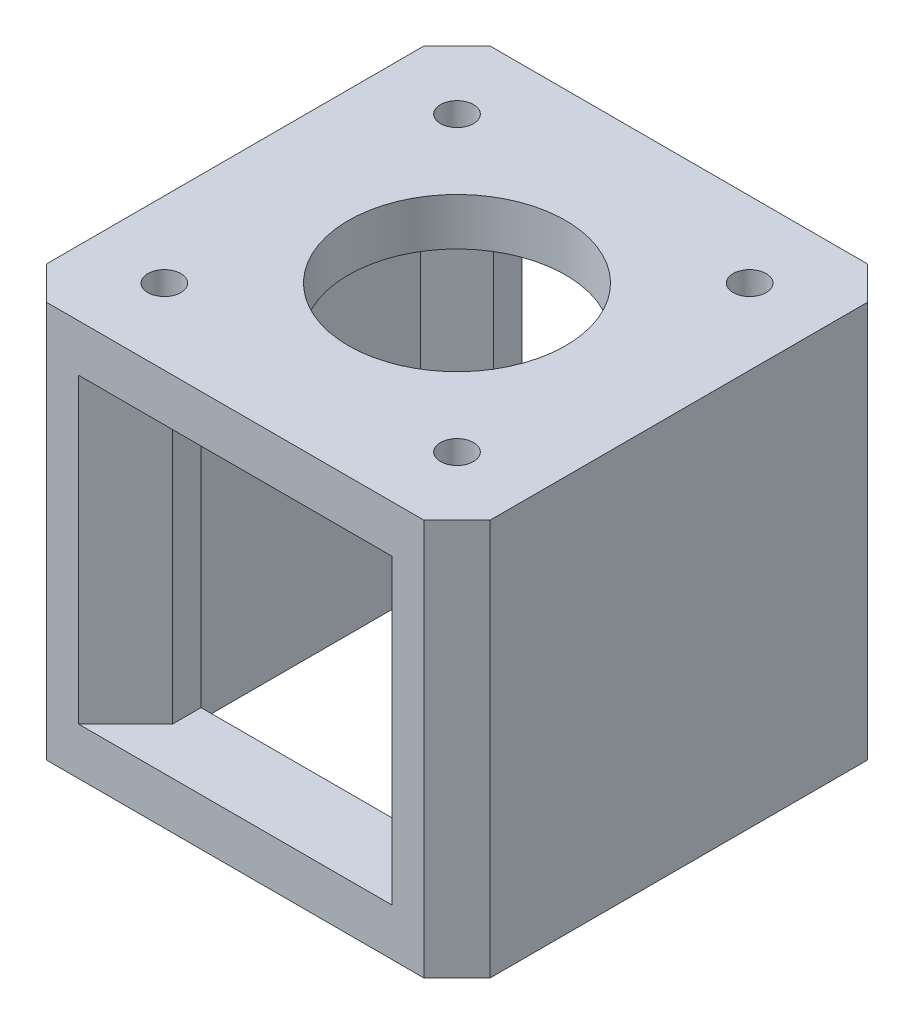
ISO-10303-21;
HEADER;
FILE_DESCRIPTION(('STEP AP214'),'2;1');
FILE_NAME('part.step','',(''),(''),'','','');
FILE_SCHEMA(('AUTOMOTIVE_DESIGN { 1 0 10303 214 1 1 1 1 }'));
ENDSEC;
DATA;
#1=APPLICATION_CONTEXT('core data for automotive mechanical design processes');
#2=APPLICATION_PROTOCOL_DEFINITION('international standard','automotive_design',2000,#1);
#3=PRODUCT_CONTEXT('',#1,'mechanical');
#4=PRODUCT('Part','Part','',(#3));
#5=PRODUCT_RELATED_PRODUCT_CATEGORY('part','',(#4));
#6=PRODUCT_DEFINITION_FORMATION('','',#4);
#7=PRODUCT_DEFINITION_CONTEXT('part definition',#1,'design');
#8=PRODUCT_DEFINITION('design','',#6,#7);
#9=PRODUCT_DEFINITION_SHAPE('','',#8);
#10=(LENGTH_UNIT() NAMED_UNIT(*) SI_UNIT(.MILLI.,.METRE.));
#11=(NAMED_UNIT(*) PLANE_ANGLE_UNIT() SI_UNIT($,.RADIAN.));
#12=(NAMED_UNIT(*) SI_UNIT($,.STERADIAN.) SOLID_ANGLE_UNIT());
#13=UNCERTAINTY_MEASURE_WITH_UNIT(LENGTH_MEASURE(1.E-05),#10,'distance_accuracy_value','');
#14=(GEOMETRIC_REPRESENTATION_CONTEXT(3) GLOBAL_UNCERTAINTY_ASSIGNED_CONTEXT((#13)) GLOBAL_UNIT_ASSIGNED_CONTEXT((#10,
#11,#12)) REPRESENTATION_CONTEXT('',''));
#15=CARTESIAN_POINT('',(0.,0.,0.));
#16=DIRECTION('',(0.,0.,1.));
#17=DIRECTION('',(1.,0.,0.));
#18=AXIS2_PLACEMENT_3D('',#15,#16,#17);
#19=CARTESIAN_POINT('',(0.,5.,0.));
#20=DIRECTION('',(0.,1.,0.));
#21=DIRECTION('',(0.,0.,1.));
#22=AXIS2_PLACEMENT_3D('',#19,#20,#21);
#23=PLANE('',#22);
#24=DIRECTION('',(1.,0.,0.));
#25=VECTOR('',#24,1.);
#26=CARTESIAN_POINT('',(0.,5.,0.));
#27=LINE('',#26,#25);
#28=CARTESIAN_POINT('',(6.88908729652595,5.,0.));
#29=VERTEX_POINT('',#28);
#30=CARTESIAN_POINT('',(40.110912703474,5.,0.));
#31=VERTEX_POINT('',#30);
#32=EDGE_CURVE('E376',#29,#31,#27,.T.);
#33=ORIENTED_EDGE('',*,*,#32,.T.);
#34=DIRECTION('',(0.707106781186547,0.,0.707106781186548));
#35=VECTOR('',#34,1.);
#36=CARTESIAN_POINT('',(40.110912703474,5.,0.));
#37=LINE('',#36,#35);
#38=CARTESIAN_POINT('',(35.110912703474,5.,-5.));
#39=VERTEX_POINT('',#38);
#40=EDGE_CURVE('E508',#31,#39,#37,.F.);
#41=ORIENTED_EDGE('',*,*,#40,.T.);
#42=DIRECTION('',(0.,0.,-1.));
#43=VECTOR('',#42,1.);
#44=CARTESIAN_POINT('',(35.110912703474,5.,0.));
#45=LINE('',#44,#43);
#46=CARTESIAN_POINT('',(35.110912703474,5.00000000000001,-8.00000000000008));
#47=VERTEX_POINT('',#46);
#48=EDGE_CURVE('E339',#39,#47,#45,.T.);
#49=ORIENTED_EDGE('',*,*,#48,.T.);
#50=DIRECTION('',(-1.,0.,0.));
#51=VECTOR('',#50,1.);
#52=CARTESIAN_POINT('',(0.,5.,-8.00000000000008));
#53=LINE('',#52,#51);
#54=CARTESIAN_POINT('',(11.889087296526,5.00000000000001,-8.00000000000008));
#55=VERTEX_POINT('',#54);
#56=EDGE_CURVE('E383',#47,#55,#53,.T.);
#57=ORIENTED_EDGE('',*,*,#56,.T.);
#58=DIRECTION('',(0.,0.,1.));
#59=VECTOR('',#58,1.);
#60=CARTESIAN_POINT('',(11.889087296526,5.,0.));
#61=LINE('',#60,#59);
#62=CARTESIAN_POINT('',(11.889087296526,5.,-5.));
#63=VERTEX_POINT('',#62);
#64=EDGE_CURVE('E367',#55,#63,#61,.T.);
#65=ORIENTED_EDGE('',*,*,#64,.T.);
#66=DIRECTION('',(0.707106781186549,0.,-0.707106781186546));
#67=VECTOR('',#66,1.);
#68=CARTESIAN_POINT('',(11.889087296526,5.,-5.));
#69=LINE('',#68,#67);
#70=EDGE_CURVE('E501',#63,#29,#69,.F.);
#71=ORIENTED_EDGE('',*,*,#70,.T.);
#72=EDGE_LOOP('',(#33,#41,#49,#57,#65,#71));
#73=FACE_BOUND('',#72,.T.);
#74=ADVANCED_FACE('F118',(#73),#23,.T.);
#75=DIRECTION('',(1.,0.,0.));
#76=VECTOR('',#75,1.);
#77=CARTESIAN_POINT('',(0.,5.,-39.0000000000001));
#78=LINE('',#77,#76);
#79=CARTESIAN_POINT('',(11.889087296526,5.00000000000001,-39.0000000000001));
#80=VERTEX_POINT('',#79);
#81=CARTESIAN_POINT('',(35.110912703474,5.00000000000001,-39.0000000000001));
#82=VERTEX_POINT('',#81);
#83=EDGE_CURVE('E387',#80,#82,#78,.T.);
#84=ORIENTED_EDGE('',*,*,#83,.T.);
#85=DIRECTION('',(0.,0.,-1.));
#86=VECTOR('',#85,1.);
#87=CARTESIAN_POINT('',(35.110912703474,5.,0.));
#88=LINE('',#87,#86);
#89=CARTESIAN_POINT('',(35.110912703474,5.,-42.0000000000002));
#90=VERTEX_POINT('',#89);
#91=EDGE_CURVE('E322',#82,#90,#88,.T.);
#92=ORIENTED_EDGE('',*,*,#91,.T.);
#93=DIRECTION('',(0.707106781186549,0.,-0.707106781186546));
#94=VECTOR('',#93,1.);
#95=CARTESIAN_POINT('',(35.110912703474,5.,-42.0000000000002));
#96=LINE('',#95,#94);
#97=CARTESIAN_POINT('',(40.110912703474,5.,-47.0000000000002));
#98=VERTEX_POINT('',#97);
#99=EDGE_CURVE('E515',#90,#98,#96,.T.);
#100=ORIENTED_EDGE('',*,*,#99,.T.);
#101=DIRECTION('',(1.,0.,0.));
#102=VECTOR('',#101,1.);
#103=CARTESIAN_POINT('',(0.,5.,-47.0000000000002));
#104=LINE('',#103,#102);
#105=CARTESIAN_POINT('',(6.88908729652598,5.,-47.0000000000002));
#106=VERTEX_POINT('',#105);
#107=EDGE_CURVE('E379',#106,#98,#104,.T.);
#108=ORIENTED_EDGE('',*,*,#107,.F.);
#109=DIRECTION('',(-0.707106781186546,0.,-0.707106781186549));
#110=VECTOR('',#109,1.);
#111=CARTESIAN_POINT('',(6.88908729652598,5.,-47.0000000000002));
#112=LINE('',#111,#110);
#113=CARTESIAN_POINT('',(11.889087296526,5.,-42.0000000000001));
#114=VERTEX_POINT('',#113);
#115=EDGE_CURVE('E521',#106,#114,#112,.F.);
#116=ORIENTED_EDGE('',*,*,#115,.T.);
#117=DIRECTION('',(0.,0.,-1.));
#118=VECTOR('',#117,1.);
#119=CARTESIAN_POINT('',(11.889087296526,5.,0.));
#120=LINE('',#119,#118);
#121=EDGE_CURVE('E371',#80,#114,#120,.T.);
#122=ORIENTED_EDGE('',*,*,#121,.F.);
#123=EDGE_LOOP('',(#84,#92,#100,#108,#116,#122));
#124=FACE_BOUND('',#123,.T.);
#125=ADVANCED_FACE('F678',(#124),#23,.T.);
#126=CARTESIAN_POINT('',(13.555456351737,5.,13.555456351737));
#127=DIRECTION('',(0.707106781186549,0.,0.707106781186546));
#128=DIRECTION('',(0.707106781186546,0.,-0.707106781186549));
#129=AXIS2_PLACEMENT_3D('',#126,#127,#128);
#130=PLANE('',#129);
#131=DIRECTION('',(0.,-1.,0.));
#132=VECTOR('',#131,1.);
#133=CARTESIAN_POINT('',(35.110912703474,42.,-8.00000000000008));
#134=LINE('',#133,#132);
#135=CARTESIAN_POINT('',(35.110912703474,37.,-8.00000000000008));
#136=VERTEX_POINT('',#135);
#137=EDGE_CURVE('E325',#136,#47,#134,.T.);
#138=ORIENTED_EDGE('',*,*,#137,.F.);
#139=DIRECTION('',(0.707106781186546,0.,-0.707106781186549));
#140=VECTOR('',#139,1.);
#141=CARTESIAN_POINT('',(13.555456351737,37.,13.555456351737));
#142=LINE('',#141,#140);
#143=CARTESIAN_POINT('',(38.9999999999999,37.,-11.889087296526));
#144=VERTEX_POINT('',#143);
#145=EDGE_CURVE('E634',#136,#144,#142,.T.);
#146=ORIENTED_EDGE('',*,*,#145,.T.);
#147=DIRECTION('',(0.,-1.,0.));
#148=VECTOR('',#147,1.);
#149=CARTESIAN_POINT('',(38.9999999999999,5.,-11.889087296526));
#150=LINE('',#149,#148);
#151=CARTESIAN_POINT('',(38.9999999999999,0.,-11.889087296526));
#152=VERTEX_POINT('',#151);
#153=EDGE_CURVE('E390',#144,#152,#150,.T.);
#154=ORIENTED_EDGE('',*,*,#153,.T.);
#155=DIRECTION('',(-0.707106781186546,0.,0.707106781186549));
#156=VECTOR('',#155,1.);
#157=CARTESIAN_POINT('',(13.555456351737,0.,13.555456351737));
#158=LINE('',#157,#156);
#159=CARTESIAN_POINT('',(35.110912703474,0.,-8.00000000000008));
#160=VERTEX_POINT('',#159);
#161=EDGE_CURVE('E410',#152,#160,#158,.T.);
#162=ORIENTED_EDGE('',*,*,#161,.T.);
#163=DIRECTION('',(0.,-1.,0.));
#164=VECTOR('',#163,1.);
#165=CARTESIAN_POINT('',(35.110912703474,5.,-8.00000000000008));
#166=LINE('',#165,#164);
#167=EDGE_CURVE('E306',#47,#160,#166,.T.);
#168=ORIENTED_EDGE('',*,*,#167,.F.);
#169=EDGE_LOOP('',(#138,#146,#154,#162,#168));
#170=FACE_BOUND('',#169,.T.);
#171=ADVANCED_FACE('F684',(#170),#130,.F.);
#172=CARTESIAN_POINT('',(0.,5.,-8.00000000000008));
#173=DIRECTION('',(0.,0.,1.));
#174=DIRECTION('',(1.,0.,0.));
#175=AXIS2_PLACEMENT_3D('',#172,#173,#174);
#176=PLANE('',#175);
#177=DIRECTION('',(-1.,0.,0.));
#178=VECTOR('',#177,1.);
#179=CARTESIAN_POINT('',(0.,0.,-8.00000000000008));
#180=LINE('',#179,#178);
#181=CARTESIAN_POINT('',(11.889087296526,0.,-8.00000000000008));
#182=VERTEX_POINT('',#181);
#183=EDGE_CURVE('E414',#160,#182,#180,.T.);
#184=ORIENTED_EDGE('',*,*,#183,.T.);
#185=DIRECTION('',(0.,-1.,0.));
#186=VECTOR('',#185,1.);
#187=CARTESIAN_POINT('',(11.889087296526,5.,-8.00000000000008));
#188=LINE('',#187,#186);
#189=EDGE_CURVE('E466',#55,#182,#188,.T.);
#190=ORIENTED_EDGE('',*,*,#189,.F.);
#191=ORIENTED_EDGE('',*,*,#56,.F.);
#192=ORIENTED_EDGE('',*,*,#167,.T.);
#193=EDGE_LOOP('',(#184,#190,#191,#192));
#194=FACE_BOUND('',#193,.T.);
#195=ADVANCED_FACE('F725',(#194),#176,.F.);
#196=CARTESIAN_POINT('',(9.94454364826305,5.,-9.94454364826302));
#197=DIRECTION('',(-0.707106781186549,0.,0.707106781186546));
#198=DIRECTION('',(0.707106781186546,0.,0.707106781186549));
#199=AXIS2_PLACEMENT_3D('',#196,#197,#198);
#200=PLANE('',#199);
#201=DIRECTION('',(0.,-1.,0.));
#202=VECTOR('',#201,1.);
#203=CARTESIAN_POINT('',(8.00000000000008,5.,-11.889087296526));
#204=LINE('',#203,#202);
#205=CARTESIAN_POINT('',(8.00000000000009,37.,-11.889087296526));
#206=VERTEX_POINT('',#205);
#207=CARTESIAN_POINT('',(8.00000000000008,0.,-11.889087296526));
#208=VERTEX_POINT('',#207);
#209=EDGE_CURVE('E463',#206,#208,#204,.T.);
#210=ORIENTED_EDGE('',*,*,#209,.F.);
#211=DIRECTION('',(0.707106781186546,0.,0.707106781186549));
#212=VECTOR('',#211,1.);
#213=CARTESIAN_POINT('',(9.94454364826305,37.,-9.94454364826302));
#214=LINE('',#213,#212);
#215=CARTESIAN_POINT('',(11.889087296526,37.,-8.00000000000008));
#216=VERTEX_POINT('',#215);
#217=EDGE_CURVE('E623',#206,#216,#214,.T.);
#218=ORIENTED_EDGE('',*,*,#217,.T.);
#219=DIRECTION('',(0.,-1.,0.));
#220=VECTOR('',#219,1.);
#221=CARTESIAN_POINT('',(11.889087296526,42.,-8.00000000000008));
#222=LINE('',#221,#220);
#223=EDGE_CURVE('E361',#216,#55,#222,.T.);
#224=ORIENTED_EDGE('',*,*,#223,.T.);
#225=ORIENTED_EDGE('',*,*,#189,.T.);
#226=DIRECTION('',(-0.707106781186546,0.,-0.707106781186549));
#227=VECTOR('',#226,1.);
#228=CARTESIAN_POINT('',(9.94454364826305,0.,-9.94454364826302));
#229=LINE('',#228,#227);
#230=EDGE_CURVE('E417',#182,#208,#229,.T.);
#231=ORIENTED_EDGE('',*,*,#230,.T.);
#232=EDGE_LOOP('',(#210,#218,#224,#225,#231));
#233=FACE_BOUND('',#232,.T.);
#234=ADVANCED_FACE('F721',(#233),#200,.F.);
#235=CARTESIAN_POINT('',(8.00000000000008,5.,0.));
#236=DIRECTION('',(1.,0.,0.));
#237=DIRECTION('',(0.,0.,-1.));
#238=AXIS2_PLACEMENT_3D('',#235,#236,#237);
#239=PLANE('',#238);
#240=DIRECTION('',(0.,0.,-1.));
#241=VECTOR('',#240,1.);
#242=CARTESIAN_POINT('',(8.00000000000008,37.,0.));
#243=LINE('',#242,#241);
#244=CARTESIAN_POINT('',(8.00000000000008,37.,-35.1109127034742));
#245=VERTEX_POINT('',#244);
#246=EDGE_CURVE('E620',#206,#245,#243,.T.);
#247=ORIENTED_EDGE('',*,*,#246,.F.);
#248=ORIENTED_EDGE('',*,*,#209,.T.);
#249=DIRECTION('',(0.,0.,1.));
#250=VECTOR('',#249,1.);
#251=CARTESIAN_POINT('',(8.00000000000008,0.,0.));
#252=LINE('',#251,#250);
#253=CARTESIAN_POINT('',(8.00000000000008,0.,-35.1109127034742));
#254=VERTEX_POINT('',#253);
#255=EDGE_CURVE('E421',#254,#208,#252,.T.);
#256=ORIENTED_EDGE('',*,*,#255,.F.);
#257=DIRECTION('',(0.,-1.,0.));
#258=VECTOR('',#257,1.);
#259=CARTESIAN_POINT('',(8.00000000000008,5.,-35.1109127034742));
#260=LINE('',#259,#258);
#261=EDGE_CURVE('E460',#245,#254,#260,.T.);
#262=ORIENTED_EDGE('',*,*,#261,.F.);
#263=EDGE_LOOP('',(#247,#248,#256,#262));
#264=FACE_BOUND('',#263,.T.);
#265=ADVANCED_FACE('F717',(#264),#239,.T.);
#266=CARTESIAN_POINT('',(-13.555456351737,5.,-13.555456351737));
#267=DIRECTION('',(0.707106781186548,0.,0.707106781186547));
#268=DIRECTION('',(0.707106781186547,0.,-0.707106781186548));
#269=AXIS2_PLACEMENT_3D('',#266,#267,#268);
#270=PLANE('',#269);
#271=DIRECTION('',(0.707106781186547,0.,-0.707106781186548));
#272=VECTOR('',#271,1.);
#273=CARTESIAN_POINT('',(-13.555456351737,37.,-13.555456351737));
#274=LINE('',#273,#272);
#275=CARTESIAN_POINT('',(11.889087296526,37.,-39.0000000000001));
#276=VERTEX_POINT('',#275);
#277=EDGE_CURVE('E617',#245,#276,#274,.T.);
#278=ORIENTED_EDGE('',*,*,#277,.F.);
#279=ORIENTED_EDGE('',*,*,#261,.T.);
#280=DIRECTION('',(-0.707106781186547,0.,0.707106781186548));
#281=VECTOR('',#280,1.);
#282=CARTESIAN_POINT('',(-13.555456351737,0.,-13.555456351737));
#283=LINE('',#282,#281);
#284=CARTESIAN_POINT('',(11.889087296526,0.,-39.0000000000001));
#285=VERTEX_POINT('',#284);
#286=EDGE_CURVE('E425',#285,#254,#283,.T.);
#287=ORIENTED_EDGE('',*,*,#286,.F.);
#288=DIRECTION('',(0.,-1.,0.));
#289=VECTOR('',#288,1.);
#290=CARTESIAN_POINT('',(11.889087296526,5.,-39.0000000000001));
#291=LINE('',#290,#289);
#292=EDGE_CURVE('E457',#80,#285,#291,.T.);
#293=ORIENTED_EDGE('',*,*,#292,.F.);
#294=DIRECTION('',(0.,-1.,0.));
#295=VECTOR('',#294,1.);
#296=CARTESIAN_POINT('',(11.889087296526,42.,-39.0000000000001));
#297=LINE('',#296,#295);
#298=EDGE_CURVE('E364',#276,#80,#297,.T.);
#299=ORIENTED_EDGE('',*,*,#298,.F.);
#300=EDGE_LOOP('',(#278,#279,#287,#293,#299));
#301=FACE_BOUND('',#300,.T.);
#302=ADVANCED_FACE('F713',(#301),#270,.T.);
#303=CARTESIAN_POINT('',(0.,5.,-39.0000000000001));
#304=DIRECTION('',(0.,0.,-1.));
#305=DIRECTION('',(-1.,0.,0.));
#306=AXIS2_PLACEMENT_3D('',#303,#304,#305);
#307=PLANE('',#306);
#308=DIRECTION('',(1.,0.,0.));
#309=VECTOR('',#308,1.);
#310=CARTESIAN_POINT('',(0.,0.,-39.0000000000001));
#311=LINE('',#310,#309);
#312=CARTESIAN_POINT('',(35.110912703474,0.,-39.0000000000001));
#313=VERTEX_POINT('',#312);
#314=EDGE_CURVE('E429',#285,#313,#311,.T.);
#315=ORIENTED_EDGE('',*,*,#314,.T.);
#316=DIRECTION('',(0.,-1.,0.));
#317=VECTOR('',#316,1.);
#318=CARTESIAN_POINT('',(35.110912703474,5.,-39.0000000000001));
#319=LINE('',#318,#317);
#320=EDGE_CURVE('E454',#82,#313,#319,.T.);
#321=ORIENTED_EDGE('',*,*,#320,.F.);
#322=ORIENTED_EDGE('',*,*,#83,.F.);
#323=ORIENTED_EDGE('',*,*,#292,.T.);
#324=EDGE_LOOP('',(#315,#321,#322,#323));
#325=FACE_BOUND('',#324,.T.);
#326=ADVANCED_FACE('F710',(#325),#307,.F.);
#327=CARTESIAN_POINT('',(37.0554563517371,5.,-37.0554563517369));
#328=DIRECTION('',(0.707106781186549,0.,-0.707106781186546));
#329=DIRECTION('',(-0.707106781186546,0.,-0.707106781186549));
#330=AXIS2_PLACEMENT_3D('',#327,#328,#329);
#331=PLANE('',#330);
#332=DIRECTION('',(0.,-1.,0.));
#333=VECTOR('',#332,1.);
#334=CARTESIAN_POINT('',(38.9999999999999,5.,-35.1109127034742));
#335=LINE('',#334,#333);
#336=CARTESIAN_POINT('',(38.9999999999999,37.,-35.1109127034742));
#337=VERTEX_POINT('',#336);
#338=CARTESIAN_POINT('',(38.9999999999999,0.,-35.1109127034742));
#339=VERTEX_POINT('',#338);
#340=EDGE_CURVE('E315',#337,#339,#335,.T.);
#341=ORIENTED_EDGE('',*,*,#340,.F.);
#342=DIRECTION('',(-0.707106781186546,0.,-0.707106781186549));
#343=VECTOR('',#342,1.);
#344=CARTESIAN_POINT('',(37.0554563517371,37.,-37.0554563517369));
#345=LINE('',#344,#343);
#346=CARTESIAN_POINT('',(35.110912703474,37.,-39.0000000000001));
#347=VERTEX_POINT('',#346);
#348=EDGE_CURVE('E296',#337,#347,#345,.T.);
#349=ORIENTED_EDGE('',*,*,#348,.T.);
#350=DIRECTION('',(0.,-1.,0.));
#351=VECTOR('',#350,1.);
#352=CARTESIAN_POINT('',(35.110912703474,42.,-39.0000000000001));
#353=LINE('',#352,#351);
#354=EDGE_CURVE('E312',#347,#82,#353,.T.);
#355=ORIENTED_EDGE('',*,*,#354,.T.);
#356=ORIENTED_EDGE('',*,*,#320,.T.);
#357=DIRECTION('',(0.707106781186546,0.,0.707106781186549));
#358=VECTOR('',#357,1.);
#359=CARTESIAN_POINT('',(37.0554563517371,0.,-37.0554563517369));
#360=LINE('',#359,#358);
#361=EDGE_CURVE('E432',#313,#339,#360,.T.);
#362=ORIENTED_EDGE('',*,*,#361,.T.);
#363=EDGE_LOOP('',(#341,#349,#355,#356,#362));
#364=FACE_BOUND('',#363,.T.);
#365=ADVANCED_FACE('F310',(#364),#331,.F.);
#366=CARTESIAN_POINT('',(0.,5.,0.));
#367=DIRECTION('',(0.,0.,-1.));
#368=DIRECTION('',(-1.,0.,0.));
#369=AXIS2_PLACEMENT_3D('',#366,#367,#368);
#370=PLANE('',#369);
#371=ORIENTED_EDGE('',*,*,#32,.F.);
#372=DIRECTION('',(0.,1.,0.));
#373=VECTOR('',#372,1.);
#374=CARTESIAN_POINT('',(6.88908729652595,5.,0.));
#375=LINE('',#374,#373);
#376=CARTESIAN_POINT('',(6.88908729652595,37.,0.));
#377=VERTEX_POINT('',#376);
#378=EDGE_CURVE('E480',#29,#377,#375,.T.);
#379=ORIENTED_EDGE('',*,*,#378,.T.);
#380=DIRECTION('',(-1.,0.,0.));
#381=VECTOR('',#380,1.);
#382=CARTESIAN_POINT('',(0.,37.,0.));
#383=LINE('',#382,#381);
#384=CARTESIAN_POINT('',(40.110912703474,37.,0.));
#385=VERTEX_POINT('',#384);
#386=EDGE_CURVE('E642',#385,#377,#383,.T.);
#387=ORIENTED_EDGE('',*,*,#386,.F.);
#388=DIRECTION('',(0.,-1.,0.));
#389=VECTOR('',#388,1.);
#390=CARTESIAN_POINT('',(40.110912703474,5.,0.));
#391=LINE('',#390,#389);
#392=EDGE_CURVE('E476',#385,#31,#391,.T.);
#393=ORIENTED_EDGE('',*,*,#392,.T.);
#394=EDGE_LOOP('',(#371,#379,#387,#393));
#395=FACE_BOUND('',#394,.T.);
#396=DIRECTION('',(1.,0.,0.));
#397=VECTOR('',#396,1.);
#398=CARTESIAN_POINT('',(0.,0.,0.));
#399=LINE('',#398,#397);
#400=CARTESIAN_POINT('',(3.50000000000002,0.,0.));
#401=VERTEX_POINT('',#400);
#402=CARTESIAN_POINT('',(43.5,0.,0.));
#403=VERTEX_POINT('',#402);
#404=EDGE_CURVE('E375',#401,#403,#399,.T.);
#405=ORIENTED_EDGE('',*,*,#404,.T.);
#406=DIRECTION('',(0.,1.,0.));
#407=VECTOR('',#406,1.);
#408=CARTESIAN_POINT('',(43.5,5.,0.));
#409=LINE('',#408,#407);
#410=CARTESIAN_POINT('',(43.5,42.,0.));
#411=VERTEX_POINT('',#410);
#412=EDGE_CURVE('E551',#403,#411,#409,.T.);
#413=ORIENTED_EDGE('',*,*,#412,.T.);
#414=DIRECTION('',(1.,0.,0.));
#415=VECTOR('',#414,1.);
#416=CARTESIAN_POINT('',(0.,42.,0.));
#417=LINE('',#416,#415);
#418=CARTESIAN_POINT('',(3.50000000000002,42.,0.));
#419=VERTEX_POINT('',#418);
#420=EDGE_CURVE('E353',#419,#411,#417,.T.);
#421=ORIENTED_EDGE('',*,*,#420,.F.);
#422=DIRECTION('',(0.,-1.,0.));
#423=VECTOR('',#422,1.);
#424=CARTESIAN_POINT('',(3.50000000000002,0.,0.));
#425=LINE('',#424,#423);
#426=EDGE_CURVE('E547',#419,#401,#425,.T.);
#427=ORIENTED_EDGE('',*,*,#426,.T.);
#428=EDGE_LOOP('',(#405,#413,#421,#427));
#429=FACE_BOUND('',#428,.T.);
#430=ADVANCED_FACE('F596',(#395,#429),#370,.F.);
#431=CARTESIAN_POINT('',(47.,5.,0.));
#432=DIRECTION('',(-1.,0.,0.));
#433=DIRECTION('',(0.,0.,1.));
#434=AXIS2_PLACEMENT_3D('',#431,#432,#433);
#435=PLANE('',#434);
#436=DIRECTION('',(0.,0.,-1.));
#437=VECTOR('',#436,1.);
#438=CARTESIAN_POINT('',(47.,42.,0.));
#439=LINE('',#438,#437);
#440=CARTESIAN_POINT('',(47.,42.,-3.50000000000002));
#441=VERTEX_POINT('',#440);
#442=CARTESIAN_POINT('',(47.0000000000001,42.,-43.5000000000001));
#443=VERTEX_POINT('',#442);
#444=EDGE_CURVE('E333',#441,#443,#439,.T.);
#445=ORIENTED_EDGE('',*,*,#444,.F.);
#446=DIRECTION('',(0.,-1.,0.));
#447=VECTOR('',#446,1.);
#448=CARTESIAN_POINT('',(47.,5.,-3.50000000000002));
#449=LINE('',#448,#447);
#450=CARTESIAN_POINT('',(47.,0.,-3.50000000000002));
#451=VERTEX_POINT('',#450);
#452=EDGE_CURVE('E531',#441,#451,#449,.T.);
#453=ORIENTED_EDGE('',*,*,#452,.T.);
#454=DIRECTION('',(0.,0.,-1.));
#455=VECTOR('',#454,1.);
#456=CARTESIAN_POINT('',(47.,0.,0.));
#457=LINE('',#456,#455);
#458=CARTESIAN_POINT('',(47.0000000000001,0.,-43.5000000000001));
#459=VERTEX_POINT('',#458);
#460=EDGE_CURVE('E394',#451,#459,#457,.T.);
#461=ORIENTED_EDGE('',*,*,#460,.T.);
#462=DIRECTION('',(0.,1.,0.));
#463=VECTOR('',#462,1.);
#464=CARTESIAN_POINT('',(47.0000000000001,42.,-43.5000000000001));
#465=LINE('',#464,#463);
#466=EDGE_CURVE('E528',#459,#443,#465,.T.);
#467=ORIENTED_EDGE('',*,*,#466,.T.);
#468=EDGE_LOOP('',(#445,#453,#461,#467));
#469=FACE_BOUND('',#468,.T.);
#470=ADVANCED_FACE('F604',(#469),#435,.F.);
#471=CARTESIAN_POINT('',(0.,5.,-47.0000000000002));
#472=DIRECTION('',(0.,0.,-1.));
#473=DIRECTION('',(-1.,0.,0.));
#474=AXIS2_PLACEMENT_3D('',#471,#472,#473);
#475=PLANE('',#474);
#476=ORIENTED_EDGE('',*,*,#107,.T.);
#477=DIRECTION('',(0.,1.,0.));
#478=VECTOR('',#477,1.);
#479=CARTESIAN_POINT('',(40.110912703474,37.,-47.0000000000002));
#480=LINE('',#479,#478);
#481=CARTESIAN_POINT('',(40.110912703474,37.,-47.0000000000002));
#482=VERTEX_POINT('',#481);
#483=EDGE_CURVE('E494',#98,#482,#480,.T.);
#484=ORIENTED_EDGE('',*,*,#483,.T.);
#485=DIRECTION('',(-1.,0.,0.));
#486=VECTOR('',#485,1.);
#487=CARTESIAN_POINT('',(0.,37.,-47.0000000000002));
#488=LINE('',#487,#486);
#489=CARTESIAN_POINT('',(6.88908729652598,37.,-47.0000000000002));
#490=VERTEX_POINT('',#489);
#491=EDGE_CURVE('E318',#482,#490,#488,.T.);
#492=ORIENTED_EDGE('',*,*,#491,.T.);
#493=DIRECTION('',(0.,-1.,0.));
#494=VECTOR('',#493,1.);
#495=CARTESIAN_POINT('',(6.88908729652598,5.,-47.0000000000002));
#496=LINE('',#495,#494);
#497=EDGE_CURVE('E490',#490,#106,#496,.T.);
#498=ORIENTED_EDGE('',*,*,#497,.T.);
#499=EDGE_LOOP('',(#476,#484,#492,#498));
#500=FACE_BOUND('',#499,.T.);
#501=DIRECTION('',(1.,0.,0.));
#502=VECTOR('',#501,1.);
#503=CARTESIAN_POINT('',(0.,0.,-47.0000000000002));
#504=LINE('',#503,#502);
#505=CARTESIAN_POINT('',(3.49999999999995,0.,-47.0000000000002));
#506=VERTEX_POINT('',#505);
#507=CARTESIAN_POINT('',(43.5,0.,-47.0000000000002));
#508=VERTEX_POINT('',#507);
#509=EDGE_CURVE('E398',#506,#508,#504,.T.);
#510=ORIENTED_EDGE('',*,*,#509,.F.);
#511=DIRECTION('',(0.,1.,0.));
#512=VECTOR('',#511,1.);
#513=CARTESIAN_POINT('',(3.49999999999995,5.,-47.0000000000002));
#514=LINE('',#513,#512);
#515=CARTESIAN_POINT('',(3.49999999999995,42.,-47.0000000000002));
#516=VERTEX_POINT('',#515);
#517=EDGE_CURVE('E12',#506,#516,#514,.T.);
#518=ORIENTED_EDGE('',*,*,#517,.T.);
#519=DIRECTION('',(1.,0.,0.));
#520=VECTOR('',#519,1.);
#521=CARTESIAN_POINT('',(0.,42.,-47.0000000000002));
#522=LINE('',#521,#520);
#523=CARTESIAN_POINT('',(43.5,42.,-47.0000000000002));
#524=VERTEX_POINT('',#523);
#525=EDGE_CURVE('E346',#516,#524,#522,.T.);
#526=ORIENTED_EDGE('',*,*,#525,.T.);
#527=DIRECTION('',(0.,-1.,0.));
#528=VECTOR('',#527,1.);
#529=CARTESIAN_POINT('',(43.5,0.,-47.0000000000002));
#530=LINE('',#529,#528);
#531=EDGE_CURVE('E128',#524,#508,#530,.T.);
#532=ORIENTED_EDGE('',*,*,#531,.T.);
#533=EDGE_LOOP('',(#510,#518,#526,#532));
#534=FACE_BOUND('',#533,.T.);
#535=ADVANCED_FACE('F575',(#500,#534),#475,.T.);
#536=CARTESIAN_POINT('',(7.99999999999999,5.,-8.00000000000007));
#537=DIRECTION('',(0.,-1.,0.));
#538=DIRECTION('',(0.,0.,-1.));
#539=AXIS2_PLACEMENT_3D('',#536,#537,#538);
#540=CYLINDRICAL_SURFACE('',#539,1.75);
#541=CARTESIAN_POINT('',(7.99999999999999,0.,-8.00000000000007));
#542=DIRECTION('',(0.,1.,0.));
#543=DIRECTION('',(0.,0.,1.));
#544=AXIS2_PLACEMENT_3D('',#541,#542,#543);
#545=CIRCLE('',#544,1.75);
#546=CARTESIAN_POINT('',(7.99999999999999,0.,-6.25000000000007));
#547=VERTEX_POINT('',#546);
#548=EDGE_CURVE('E443',#547,#547,#545,.T.);
#549=ORIENTED_EDGE('',*,*,#548,.F.);
#550=EDGE_LOOP('',(#549));
#551=FACE_BOUND('',#550,.T.);
#552=CARTESIAN_POINT('',(7.99999999999999,42.,-8.00000000000007));
#553=DIRECTION('',(0.,1.,0.));
#554=DIRECTION('',(0.,0.,1.));
#555=AXIS2_PLACEMENT_3D('',#552,#553,#554);
#556=CIRCLE('',#555,1.75);
#557=CARTESIAN_POINT('',(7.99999999999999,42.,-6.25000000000007));
#558=VERTEX_POINT('',#557);
#559=EDGE_CURVE('E342',#558,#558,#556,.T.);
#560=ORIENTED_EDGE('',*,*,#559,.T.);
#561=EDGE_LOOP('',(#560));
#562=FACE_BOUND('',#561,.T.);
#563=ADVANCED_FACE('F695',(#551,#562),#540,.F.);
#564=CARTESIAN_POINT('',(39.,5.,-39.0000000000001));
#565=DIRECTION('',(0.,-1.,0.));
#566=DIRECTION('',(0.,0.,-1.));
#567=AXIS2_PLACEMENT_3D('',#564,#565,#566);
#568=CYLINDRICAL_SURFACE('',#567,1.75);
#569=CARTESIAN_POINT('',(39.,0.,-39.0000000000001));
#570=DIRECTION('',(0.,1.,0.));
#571=DIRECTION('',(0.,0.,1.));
#572=AXIS2_PLACEMENT_3D('',#569,#570,#571);
#573=CIRCLE('',#572,1.75);
#574=CARTESIAN_POINT('',(39.,0.,-37.2500000000001));
#575=VERTEX_POINT('',#574);
#576=EDGE_CURVE('E439',#575,#575,#573,.T.);
#577=ORIENTED_EDGE('',*,*,#576,.F.);
#578=EDGE_LOOP('',(#577));
#579=FACE_BOUND('',#578,.T.);
#580=CARTESIAN_POINT('',(39.,42.,-39.0000000000001));
#581=DIRECTION('',(0.,1.,0.));
#582=DIRECTION('',(0.,0.,1.));
#583=AXIS2_PLACEMENT_3D('',#580,#581,#582);
#584=CIRCLE('',#583,1.75);
#585=CARTESIAN_POINT('',(39.,42.,-37.2500000000001));
#586=VERTEX_POINT('',#585);
#587=EDGE_CURVE('E608',#586,#586,#584,.T.);
#588=ORIENTED_EDGE('',*,*,#587,.T.);
#589=EDGE_LOOP('',(#588));
#590=FACE_BOUND('',#589,.T.);
#591=ADVANCED_FACE('F698',(#579,#590),#568,.F.);
#592=CARTESIAN_POINT('',(38.9999999999999,5.,0.));
#593=DIRECTION('',(-1.,0.,0.));
#594=DIRECTION('',(0.,0.,1.));
#595=AXIS2_PLACEMENT_3D('',#592,#593,#594);
#596=PLANE('',#595);
#597=DIRECTION('',(0.,0.,1.));
#598=VECTOR('',#597,1.);
#599=CARTESIAN_POINT('',(38.9999999999999,37.,0.));
#600=LINE('',#599,#598);
#601=EDGE_CURVE('E317',#337,#144,#600,.T.);
#602=ORIENTED_EDGE('',*,*,#601,.F.);
#603=ORIENTED_EDGE('',*,*,#340,.T.);
#604=DIRECTION('',(0.,0.,-1.));
#605=VECTOR('',#604,1.);
#606=CARTESIAN_POINT('',(38.9999999999999,0.,0.));
#607=LINE('',#606,#605);
#608=EDGE_CURVE('E435',#152,#339,#607,.T.);
#609=ORIENTED_EDGE('',*,*,#608,.F.);
#610=ORIENTED_EDGE('',*,*,#153,.F.);
#611=EDGE_LOOP('',(#602,#603,#609,#610));
#612=FACE_BOUND('',#611,.T.);
#613=ADVANCED_FACE('F702',(#612),#596,.T.);
#614=CARTESIAN_POINT('',(7.99999999999999,5.,-39.0000000000001));
#615=DIRECTION('',(0.,-1.,0.));
#616=DIRECTION('',(0.,0.,-1.));
#617=AXIS2_PLACEMENT_3D('',#614,#615,#616);
#618=CYLINDRICAL_SURFACE('',#617,1.75);
#619=CARTESIAN_POINT('',(7.99999999999999,0.,-39.0000000000001));
#620=DIRECTION('',(0.,1.,0.));
#621=DIRECTION('',(0.,0.,1.));
#622=AXIS2_PLACEMENT_3D('',#619,#620,#621);
#623=CIRCLE('',#622,1.75);
#624=CARTESIAN_POINT('',(7.99999999999999,0.,-37.2500000000001));
#625=VERTEX_POINT('',#624);
#626=EDGE_CURVE('E406',#625,#625,#623,.T.);
#627=ORIENTED_EDGE('',*,*,#626,.F.);
#628=EDGE_LOOP('',(#627));
#629=FACE_BOUND('',#628,.T.);
#630=CARTESIAN_POINT('',(7.99999999999999,42.,-39.0000000000001));
#631=DIRECTION('',(0.,1.,0.));
#632=DIRECTION('',(0.,0.,1.));
#633=AXIS2_PLACEMENT_3D('',#630,#631,#632);
#634=CIRCLE('',#633,1.75);
#635=CARTESIAN_POINT('',(7.99999999999999,42.,-37.2500000000001));
#636=VERTEX_POINT('',#635);
#637=EDGE_CURVE('E357',#636,#636,#634,.T.);
#638=ORIENTED_EDGE('',*,*,#637,.T.);
#639=EDGE_LOOP('',(#638));
#640=FACE_BOUND('',#639,.T.);
#641=ADVANCED_FACE('F706',(#629,#640),#618,.F.);
#642=CARTESIAN_POINT('',(0.,5.,0.));
#643=DIRECTION('',(-1.,0.,0.));
#644=DIRECTION('',(0.,0.,1.));
#645=AXIS2_PLACEMENT_3D('',#642,#643,#644);
#646=PLANE('',#645);
#647=DIRECTION('',(0.,0.,-1.));
#648=VECTOR('',#647,1.);
#649=CARTESIAN_POINT('',(0.,0.,0.));
#650=LINE('',#649,#648);
#651=CARTESIAN_POINT('',(0.,0.,-3.50000000000002));
#652=VERTEX_POINT('',#651);
#653=CARTESIAN_POINT('',(0.,0.,-43.5000000000001));
#654=VERTEX_POINT('',#653);
#655=EDGE_CURVE('E402',#652,#654,#650,.T.);
#656=ORIENTED_EDGE('',*,*,#655,.F.);
#657=DIRECTION('',(0.,1.,0.));
#658=VECTOR('',#657,1.);
#659=CARTESIAN_POINT('',(0.,42.,-3.50000000000002));
#660=LINE('',#659,#658);
#661=CARTESIAN_POINT('',(0.,42.,-3.50000000000002));
#662=VERTEX_POINT('',#661);
#663=EDGE_CURVE('E142',#652,#662,#660,.T.);
#664=ORIENTED_EDGE('',*,*,#663,.T.);
#665=DIRECTION('',(0.,0.,-1.));
#666=VECTOR('',#665,1.);
#667=CARTESIAN_POINT('',(0.,42.,0.));
#668=LINE('',#667,#666);
#669=CARTESIAN_POINT('',(0.,42.,-43.5000000000001));
#670=VERTEX_POINT('',#669);
#671=EDGE_CURVE('E350',#662,#670,#668,.T.);
#672=ORIENTED_EDGE('',*,*,#671,.T.);
#673=DIRECTION('',(0.,-1.,0.));
#674=VECTOR('',#673,1.);
#675=CARTESIAN_POINT('',(0.,5.,-43.5000000000001));
#676=LINE('',#675,#674);
#677=EDGE_CURVE('E565',#670,#654,#676,.T.);
#678=ORIENTED_EDGE('',*,*,#677,.T.);
#679=EDGE_LOOP('',(#656,#664,#672,#678));
#680=FACE_BOUND('',#679,.T.);
#681=ADVANCED_FACE('F586',(#680),#646,.T.);
#682=CARTESIAN_POINT('',(39.,5.,-8.00000000000008));
#683=DIRECTION('',(0.,-1.,0.));
#684=DIRECTION('',(0.,0.,-1.));
#685=AXIS2_PLACEMENT_3D('',#682,#683,#684);
#686=CYLINDRICAL_SURFACE('',#685,1.75);
#687=CARTESIAN_POINT('',(39.,0.,-8.00000000000008));
#688=DIRECTION('',(0.,1.,0.));
#689=DIRECTION('',(0.,0.,1.));
#690=AXIS2_PLACEMENT_3D('',#687,#688,#689);
#691=CIRCLE('',#690,1.75);
#692=CARTESIAN_POINT('',(39.,0.,-6.25000000000008));
#693=VERTEX_POINT('',#692);
#694=EDGE_CURVE('E380',#693,#693,#691,.T.);
#695=ORIENTED_EDGE('',*,*,#694,.F.);
#696=EDGE_LOOP('',(#695));
#697=FACE_BOUND('',#696,.T.);
#698=CARTESIAN_POINT('',(39.,42.,-8.00000000000008));
#699=DIRECTION('',(0.,1.,0.));
#700=DIRECTION('',(0.,0.,1.));
#701=AXIS2_PLACEMENT_3D('',#698,#699,#700);
#702=CIRCLE('',#701,1.75);
#703=CARTESIAN_POINT('',(39.,42.,-6.25000000000008));
#704=VERTEX_POINT('',#703);
#705=EDGE_CURVE('E326',#704,#704,#702,.T.);
#706=ORIENTED_EDGE('',*,*,#705,.T.);
#707=EDGE_LOOP('',(#706));
#708=FACE_BOUND('',#707,.T.);
#709=ADVANCED_FACE('F690',(#697,#708),#686,.F.);
#710=CARTESIAN_POINT('',(0.,0.,0.));
#711=DIRECTION('',(0.,1.,0.));
#712=DIRECTION('',(0.,0.,1.));
#713=AXIS2_PLACEMENT_3D('',#710,#711,#712);
#714=PLANE('',#713);
#715=ORIENTED_EDGE('',*,*,#183,.F.);
#716=ORIENTED_EDGE('',*,*,#161,.F.);
#717=ORIENTED_EDGE('',*,*,#608,.T.);
#718=ORIENTED_EDGE('',*,*,#361,.F.);
#719=ORIENTED_EDGE('',*,*,#314,.F.);
#720=ORIENTED_EDGE('',*,*,#286,.T.);
#721=ORIENTED_EDGE('',*,*,#255,.T.);
#722=ORIENTED_EDGE('',*,*,#230,.F.);
#723=EDGE_LOOP('',(#715,#716,#717,#718,#719,#720,#721,#722));
#724=FACE_BOUND('',#723,.T.);
#725=ORIENTED_EDGE('',*,*,#460,.F.);
#726=DIRECTION('',(0.707106781186548,0.,-0.707106781186547));
#727=VECTOR('',#726,1.);
#728=CARTESIAN_POINT('',(47.,0.,-3.50000000000002));
#729=LINE('',#728,#727);
#730=EDGE_CURVE('E544',#451,#403,#729,.F.);
#731=ORIENTED_EDGE('',*,*,#730,.T.);
#732=ORIENTED_EDGE('',*,*,#404,.F.);
#733=DIRECTION('',(-0.707106781186548,0.,-0.707106781186547));
#734=VECTOR('',#733,1.);
#735=CARTESIAN_POINT('',(3.50000000000002,0.,0.));
#736=LINE('',#735,#734);
#737=EDGE_CURVE('E541',#401,#652,#736,.T.);
#738=ORIENTED_EDGE('',*,*,#737,.T.);
#739=ORIENTED_EDGE('',*,*,#655,.T.);
#740=DIRECTION('',(-0.707106781186547,0.,0.707106781186548));
#741=VECTOR('',#740,1.);
#742=CARTESIAN_POINT('',(0.,0.,-43.5000000000001));
#743=LINE('',#742,#741);
#744=EDGE_CURVE('E538',#654,#506,#743,.F.);
#745=ORIENTED_EDGE('',*,*,#744,.T.);
#746=ORIENTED_EDGE('',*,*,#509,.T.);
#747=DIRECTION('',(0.707106781186548,0.,0.707106781186548));
#748=VECTOR('',#747,1.);
#749=CARTESIAN_POINT('',(43.5,0.,-47.0000000000002));
#750=LINE('',#749,#748);
#751=EDGE_CURVE('E535',#508,#459,#750,.T.);
#752=ORIENTED_EDGE('',*,*,#751,.T.);
#753=EDGE_LOOP('',(#725,#731,#732,#738,#739,#745,#746,#752));
#754=FACE_BOUND('',#753,.T.);
#755=ORIENTED_EDGE('',*,*,#576,.T.);
#756=EDGE_LOOP('',(#755));
#757=FACE_BOUND('',#756,.T.);
#758=ORIENTED_EDGE('',*,*,#694,.T.);
#759=EDGE_LOOP('',(#758));
#760=FACE_BOUND('',#759,.T.);
#761=ORIENTED_EDGE('',*,*,#626,.T.);
#762=EDGE_LOOP('',(#761));
#763=FACE_BOUND('',#762,.T.);
#764=ORIENTED_EDGE('',*,*,#548,.T.);
#765=EDGE_LOOP('',(#764));
#766=FACE_BOUND('',#765,.T.);
#767=ADVANCED_FACE('F581',(#724,#754,#757,#760,#763,#766),#714,.F.);
#768=CARTESIAN_POINT('',(11.889087296526,42.,0.));
#769=DIRECTION('',(1.,0.,0.));
#770=DIRECTION('',(0.,0.,-1.));
#771=AXIS2_PLACEMENT_3D('',#768,#769,#770);
#772=PLANE('',#771);
#773=ORIENTED_EDGE('',*,*,#121,.T.);
#774=DIRECTION('',(0.,1.,0.));
#775=VECTOR('',#774,1.);
#776=CARTESIAN_POINT('',(11.889087296526,42.,-42.0000000000001));
#777=LINE('',#776,#775);
#778=CARTESIAN_POINT('',(11.889087296526,37.,-42.0000000000001));
#779=VERTEX_POINT('',#778);
#780=EDGE_CURVE('E498',#114,#779,#777,.T.);
#781=ORIENTED_EDGE('',*,*,#780,.T.);
#782=DIRECTION('',(0.,0.,-1.));
#783=VECTOR('',#782,1.);
#784=CARTESIAN_POINT('',(11.889087296526,37.,0.));
#785=LINE('',#784,#783);
#786=EDGE_CURVE('E611',#276,#779,#785,.T.);
#787=ORIENTED_EDGE('',*,*,#786,.F.);
#788=ORIENTED_EDGE('',*,*,#298,.T.);
#789=EDGE_LOOP('',(#773,#781,#787,#788));
#790=FACE_BOUND('',#789,.T.);
#791=ADVANCED_FACE('F673',(#790),#772,.T.);
#792=CARTESIAN_POINT('',(11.889087296526,42.,0.));
#793=DIRECTION('',(-1.,0.,0.));
#794=DIRECTION('',(0.,0.,1.));
#795=AXIS2_PLACEMENT_3D('',#792,#793,#794);
#796=PLANE('',#795);
#797=DIRECTION('',(0.,0.,1.));
#798=VECTOR('',#797,1.);
#799=CARTESIAN_POINT('',(11.889087296526,37.,0.));
#800=LINE('',#799,#798);
#801=CARTESIAN_POINT('',(11.889087296526,37.,-5.));
#802=VERTEX_POINT('',#801);
#803=EDGE_CURVE('E627',#216,#802,#800,.T.);
#804=ORIENTED_EDGE('',*,*,#803,.T.);
#805=DIRECTION('',(0.,-1.,0.));
#806=VECTOR('',#805,1.);
#807=CARTESIAN_POINT('',(11.889087296526,42.,-5.));
#808=LINE('',#807,#806);
#809=EDGE_CURVE('E305',#802,#63,#808,.T.);
#810=ORIENTED_EDGE('',*,*,#809,.T.);
#811=ORIENTED_EDGE('',*,*,#64,.F.);
#812=ORIENTED_EDGE('',*,*,#223,.F.);
#813=EDGE_LOOP('',(#804,#810,#811,#812));
#814=FACE_BOUND('',#813,.T.);
#815=ADVANCED_FACE('F664',(#814),#796,.F.);
#816=CARTESIAN_POINT('',(0.,42.,0.));
#817=DIRECTION('',(0.,1.,0.));
#818=DIRECTION('',(0.,0.,1.));
#819=AXIS2_PLACEMENT_3D('',#816,#817,#818);
#820=PLANE('',#819);
#821=ORIENTED_EDGE('',*,*,#559,.F.);
#822=EDGE_LOOP('',(#821));
#823=FACE_BOUND('',#822,.T.);
#824=ORIENTED_EDGE('',*,*,#420,.T.);
#825=DIRECTION('',(-0.707106781186548,0.,0.707106781186547));
#826=VECTOR('',#825,1.);
#827=CARTESIAN_POINT('',(21.75,42.,21.75));
#828=LINE('',#827,#826);
#829=EDGE_CURVE('E562',#411,#441,#828,.F.);
#830=ORIENTED_EDGE('',*,*,#829,.T.);
#831=ORIENTED_EDGE('',*,*,#444,.T.);
#832=DIRECTION('',(-0.707106781186548,0.,-0.707106781186548));
#833=VECTOR('',#832,1.);
#834=CARTESIAN_POINT('',(45.2500000000001,42.,-45.2500000000001));
#835=LINE('',#834,#833);
#836=EDGE_CURVE('E554',#443,#524,#835,.T.);
#837=ORIENTED_EDGE('',*,*,#836,.T.);
#838=ORIENTED_EDGE('',*,*,#525,.F.);
#839=DIRECTION('',(0.707106781186547,0.,-0.707106781186548));
#840=VECTOR('',#839,1.);
#841=CARTESIAN_POINT('',(-21.7500000000001,42.,-21.7500000000001));
#842=LINE('',#841,#840);
#843=EDGE_CURVE('E135',#516,#670,#842,.F.);
#844=ORIENTED_EDGE('',*,*,#843,.T.);
#845=ORIENTED_EDGE('',*,*,#671,.F.);
#846=DIRECTION('',(0.707106781186548,0.,0.707106781186547));
#847=VECTOR('',#846,1.);
#848=CARTESIAN_POINT('',(1.75000000000001,42.,-1.75000000000001));
#849=LINE('',#848,#847);
#850=EDGE_CURVE('E559',#662,#419,#849,.T.);
#851=ORIENTED_EDGE('',*,*,#850,.T.);
#852=EDGE_LOOP('',(#824,#830,#831,#837,#838,#844,#845,#851));
#853=FACE_BOUND('',#852,.T.);
#854=ORIENTED_EDGE('',*,*,#637,.F.);
#855=EDGE_LOOP('',(#854));
#856=FACE_BOUND('',#855,.T.);
#857=ORIENTED_EDGE('',*,*,#587,.F.);
#858=EDGE_LOOP('',(#857));
#859=FACE_BOUND('',#858,.T.);
#860=ORIENTED_EDGE('',*,*,#705,.F.);
#861=EDGE_LOOP('',(#860));
#862=FACE_BOUND('',#861,.T.);
#863=CARTESIAN_POINT('',(23.5,42.,-23.5000000000001));
#864=DIRECTION('',(0.,1.,0.));
#865=DIRECTION('',(0.,0.,1.));
#866=AXIS2_PLACEMENT_3D('',#863,#864,#865);
#867=CIRCLE('',#866,11.5);
#868=CARTESIAN_POINT('',(23.5,42.,-12.0000000000001));
#869=VERTEX_POINT('',#868);
#870=EDGE_CURVE('E646',#869,#869,#867,.T.);
#871=ORIENTED_EDGE('',*,*,#870,.F.);
#872=EDGE_LOOP('',(#871));
#873=FACE_BOUND('',#872,.T.);
#874=ADVANCED_FACE('F588',(#823,#853,#856,#859,#862,#873),#820,.T.);
#875=CARTESIAN_POINT('',(35.110912703474,42.,0.));
#876=DIRECTION('',(1.,0.,0.));
#877=DIRECTION('',(0.,0.,-1.));
#878=AXIS2_PLACEMENT_3D('',#875,#876,#877);
#879=PLANE('',#878);
#880=ORIENTED_EDGE('',*,*,#48,.F.);
#881=DIRECTION('',(0.,1.,0.));
#882=VECTOR('',#881,1.);
#883=CARTESIAN_POINT('',(35.110912703474,42.,-5.));
#884=LINE('',#883,#882);
#885=CARTESIAN_POINT('',(35.110912703474,37.,-5.));
#886=VERTEX_POINT('',#885);
#887=EDGE_CURVE('E484',#39,#886,#884,.T.);
#888=ORIENTED_EDGE('',*,*,#887,.T.);
#889=DIRECTION('',(0.,0.,-1.));
#890=VECTOR('',#889,1.);
#891=CARTESIAN_POINT('',(35.110912703474,37.,0.));
#892=LINE('',#891,#890);
#893=EDGE_CURVE('E631',#886,#136,#892,.T.);
#894=ORIENTED_EDGE('',*,*,#893,.T.);
#895=ORIENTED_EDGE('',*,*,#137,.T.);
#896=EDGE_LOOP('',(#880,#888,#894,#895));
#897=FACE_BOUND('',#896,.T.);
#898=ADVANCED_FACE('F663',(#897),#879,.F.);
#899=CARTESIAN_POINT('',(35.110912703474,42.,0.));
#900=DIRECTION('',(1.,0.,0.));
#901=DIRECTION('',(0.,0.,-1.));
#902=AXIS2_PLACEMENT_3D('',#899,#900,#901);
#903=PLANE('',#902);
#904=DIRECTION('',(0.,0.,-1.));
#905=VECTOR('',#904,1.);
#906=CARTESIAN_POINT('',(35.110912703474,37.,0.));
#907=LINE('',#906,#905);
#908=CARTESIAN_POINT('',(35.110912703474,37.,-42.0000000000002));
#909=VERTEX_POINT('',#908);
#910=EDGE_CURVE('E293',#347,#909,#907,.T.);
#911=ORIENTED_EDGE('',*,*,#910,.T.);
#912=DIRECTION('',(0.,-1.,0.));
#913=VECTOR('',#912,1.);
#914=CARTESIAN_POINT('',(35.110912703474,5.,-42.0000000000002));
#915=LINE('',#914,#913);
#916=EDGE_CURVE('E487',#909,#90,#915,.T.);
#917=ORIENTED_EDGE('',*,*,#916,.T.);
#918=ORIENTED_EDGE('',*,*,#91,.F.);
#919=ORIENTED_EDGE('',*,*,#354,.F.);
#920=EDGE_LOOP('',(#911,#917,#918,#919));
#921=FACE_BOUND('',#920,.T.);
#922=ADVANCED_FACE('F320',(#921),#903,.F.);
#923=CARTESIAN_POINT('',(0.,37.,0.));
#924=DIRECTION('',(0.,-1.,0.));
#925=DIRECTION('',(0.,0.,-1.));
#926=AXIS2_PLACEMENT_3D('',#923,#924,#925);
#927=PLANE('',#926);
#928=CARTESIAN_POINT('',(23.5,37.,-23.5000000000001));
#929=DIRECTION('',(0.,1.,0.));
#930=DIRECTION('',(0.,0.,1.));
#931=AXIS2_PLACEMENT_3D('',#928,#929,#930);
#932=CIRCLE('',#931,11.5);
#933=CARTESIAN_POINT('',(23.5,37.,-12.0000000000001));
#934=VERTEX_POINT('',#933);
#935=EDGE_CURVE('E645',#934,#934,#932,.T.);
#936=ORIENTED_EDGE('',*,*,#935,.T.);
#937=EDGE_LOOP('',(#936));
#938=FACE_BOUND('',#937,.T.);
#939=ORIENTED_EDGE('',*,*,#277,.T.);
#940=ORIENTED_EDGE('',*,*,#786,.T.);
#941=DIRECTION('',(0.707106781186546,0.,0.707106781186549));
#942=VECTOR('',#941,1.);
#943=CARTESIAN_POINT('',(6.88908729652598,37.,-47.0000000000002));
#944=LINE('',#943,#942);
#945=EDGE_CURVE('E524',#779,#490,#944,.F.);
#946=ORIENTED_EDGE('',*,*,#945,.T.);
#947=ORIENTED_EDGE('',*,*,#491,.F.);
#948=DIRECTION('',(-0.707106781186549,0.,0.707106781186546));
#949=VECTOR('',#948,1.);
#950=CARTESIAN_POINT('',(35.110912703474,37.,-42.0000000000002));
#951=LINE('',#950,#949);
#952=EDGE_CURVE('E299',#482,#909,#951,.T.);
#953=ORIENTED_EDGE('',*,*,#952,.T.);
#954=ORIENTED_EDGE('',*,*,#910,.F.);
#955=ORIENTED_EDGE('',*,*,#348,.F.);
#956=ORIENTED_EDGE('',*,*,#601,.T.);
#957=ORIENTED_EDGE('',*,*,#145,.F.);
#958=ORIENTED_EDGE('',*,*,#893,.F.);
#959=DIRECTION('',(-0.707106781186547,0.,-0.707106781186548));
#960=VECTOR('',#959,1.);
#961=CARTESIAN_POINT('',(40.110912703474,37.,0.));
#962=LINE('',#961,#960);
#963=EDGE_CURVE('E511',#886,#385,#962,.F.);
#964=ORIENTED_EDGE('',*,*,#963,.T.);
#965=ORIENTED_EDGE('',*,*,#386,.T.);
#966=DIRECTION('',(-0.707106781186549,0.,0.707106781186546));
#967=VECTOR('',#966,1.);
#968=CARTESIAN_POINT('',(11.889087296526,37.,-5.));
#969=LINE('',#968,#967);
#970=EDGE_CURVE('E505',#377,#802,#969,.F.);
#971=ORIENTED_EDGE('',*,*,#970,.T.);
#972=ORIENTED_EDGE('',*,*,#803,.F.);
#973=ORIENTED_EDGE('',*,*,#217,.F.);
#974=ORIENTED_EDGE('',*,*,#246,.T.);
#975=EDGE_LOOP('',(#939,#940,#946,#947,#953,#954,#955,#956,#957,#958,#964,#965,#971,#972,#973,#974));
#976=FACE_BOUND('',#975,.T.);
#977=ADVANCED_FACE('F295',(#938,#976),#927,.T.);
#978=CARTESIAN_POINT('',(23.5,37.,-23.5000000000001));
#979=DIRECTION('',(0.,1.,0.));
#980=DIRECTION('',(0.,0.,1.));
#981=AXIS2_PLACEMENT_3D('',#978,#979,#980);
#982=CYLINDRICAL_SURFACE('',#981,11.5);
#983=ORIENTED_EDGE('',*,*,#935,.F.);
#984=EDGE_LOOP('',(#983));
#985=FACE_BOUND('',#984,.T.);
#986=ORIENTED_EDGE('',*,*,#870,.T.);
#987=EDGE_LOOP('',(#986));
#988=FACE_BOUND('',#987,.T.);
#989=ADVANCED_FACE('F655',(#985,#988),#982,.F.);
#990=CARTESIAN_POINT('',(11.889087296526,42.,-5.));
#991=DIRECTION('',(-0.707106781186546,0.,-0.707106781186549));
#992=DIRECTION('',(0.,-1.,0.));
#993=AXIS2_PLACEMENT_3D('',#990,#991,#992);
#994=PLANE('',#993);
#995=ORIENTED_EDGE('',*,*,#970,.F.);
#996=ORIENTED_EDGE('',*,*,#378,.F.);
#997=ORIENTED_EDGE('',*,*,#70,.F.);
#998=ORIENTED_EDGE('',*,*,#809,.F.);
#999=EDGE_LOOP('',(#995,#996,#997,#998));
#1000=FACE_BOUND('',#999,.T.);
#1001=ADVANCED_FACE('F658',(#1000),#994,.F.);
#1002=CARTESIAN_POINT('',(40.110912703474,5.,0.));
#1003=DIRECTION('',(0.707106781186548,0.,-0.707106781186547));
#1004=DIRECTION('',(0.,-1.,0.));
#1005=AXIS2_PLACEMENT_3D('',#1002,#1003,#1004);
#1006=PLANE('',#1005);
#1007=ORIENTED_EDGE('',*,*,#963,.F.);
#1008=ORIENTED_EDGE('',*,*,#887,.F.);
#1009=ORIENTED_EDGE('',*,*,#40,.F.);
#1010=ORIENTED_EDGE('',*,*,#392,.F.);
#1011=EDGE_LOOP('',(#1007,#1008,#1009,#1010));
#1012=FACE_BOUND('',#1011,.T.);
#1013=ADVANCED_FACE('F752',(#1012),#1006,.F.);
#1014=CARTESIAN_POINT('',(35.110912703474,42.,-42.0000000000002));
#1015=DIRECTION('',(-0.707106781186546,0.,-0.707106781186549));
#1016=DIRECTION('',(0.,1.,0.));
#1017=AXIS2_PLACEMENT_3D('',#1014,#1015,#1016);
#1018=PLANE('',#1017);
#1019=ORIENTED_EDGE('',*,*,#952,.F.);
#1020=ORIENTED_EDGE('',*,*,#483,.F.);
#1021=ORIENTED_EDGE('',*,*,#99,.F.);
#1022=ORIENTED_EDGE('',*,*,#916,.F.);
#1023=EDGE_LOOP('',(#1019,#1020,#1021,#1022));
#1024=FACE_BOUND('',#1023,.T.);
#1025=ADVANCED_FACE('F759',(#1024),#1018,.T.);
#1026=CARTESIAN_POINT('',(6.88908729652598,5.,-47.0000000000002));
#1027=DIRECTION('',(-0.707106781186549,0.,0.707106781186546));
#1028=DIRECTION('',(0.,-1.,0.));
#1029=AXIS2_PLACEMENT_3D('',#1026,#1027,#1028);
#1030=PLANE('',#1029);
#1031=ORIENTED_EDGE('',*,*,#945,.F.);
#1032=ORIENTED_EDGE('',*,*,#780,.F.);
#1033=ORIENTED_EDGE('',*,*,#115,.F.);
#1034=ORIENTED_EDGE('',*,*,#497,.F.);
#1035=EDGE_LOOP('',(#1031,#1032,#1033,#1034));
#1036=FACE_BOUND('',#1035,.T.);
#1037=ADVANCED_FACE('F766',(#1036),#1030,.F.);
#1038=CARTESIAN_POINT('',(47.,5.,-3.50000000000002));
#1039=DIRECTION('',(-0.707106781186547,0.,-0.707106781186548));
#1040=DIRECTION('',(0.,-1.,0.));
#1041=AXIS2_PLACEMENT_3D('',#1038,#1039,#1040);
#1042=PLANE('',#1041);
#1043=ORIENTED_EDGE('',*,*,#829,.F.);
#1044=ORIENTED_EDGE('',*,*,#412,.F.);
#1045=ORIENTED_EDGE('',*,*,#730,.F.);
#1046=ORIENTED_EDGE('',*,*,#452,.F.);
#1047=EDGE_LOOP('',(#1043,#1044,#1045,#1046));
#1048=FACE_BOUND('',#1047,.T.);
#1049=ADVANCED_FACE('F601',(#1048),#1042,.F.);
#1050=CARTESIAN_POINT('',(3.50000000000002,5.,0.));
#1051=DIRECTION('',(-0.707106781186547,0.,0.707106781186548));
#1052=DIRECTION('',(0.,1.,0.));
#1053=AXIS2_PLACEMENT_3D('',#1050,#1051,#1052);
#1054=PLANE('',#1053);
#1055=ORIENTED_EDGE('',*,*,#850,.F.);
#1056=ORIENTED_EDGE('',*,*,#663,.F.);
#1057=ORIENTED_EDGE('',*,*,#737,.F.);
#1058=ORIENTED_EDGE('',*,*,#426,.F.);
#1059=EDGE_LOOP('',(#1055,#1056,#1057,#1058));
#1060=FACE_BOUND('',#1059,.T.);
#1061=ADVANCED_FACE('F593',(#1060),#1054,.T.);
#1062=CARTESIAN_POINT('',(0.,5.,-43.5000000000001));
#1063=DIRECTION('',(0.707106781186548,0.,0.707106781186547));
#1064=DIRECTION('',(0.,-1.,0.));
#1065=AXIS2_PLACEMENT_3D('',#1062,#1063,#1064);
#1066=PLANE('',#1065);
#1067=ORIENTED_EDGE('',*,*,#843,.F.);
#1068=ORIENTED_EDGE('',*,*,#517,.F.);
#1069=ORIENTED_EDGE('',*,*,#744,.F.);
#1070=ORIENTED_EDGE('',*,*,#677,.F.);
#1071=EDGE_LOOP('',(#1067,#1068,#1069,#1070));
#1072=FACE_BOUND('',#1071,.T.);
#1073=ADVANCED_FACE('F585',(#1072),#1066,.F.);
#1074=CARTESIAN_POINT('',(43.5,5.,-47.0000000000002));
#1075=DIRECTION('',(0.707106781186547,0.,-0.707106781186547));
#1076=DIRECTION('',(0.,1.,0.));
#1077=AXIS2_PLACEMENT_3D('',#1074,#1075,#1076);
#1078=PLANE('',#1077);
#1079=ORIENTED_EDGE('',*,*,#836,.F.);
#1080=ORIENTED_EDGE('',*,*,#466,.F.);
#1081=ORIENTED_EDGE('',*,*,#751,.F.);
#1082=ORIENTED_EDGE('',*,*,#531,.F.);
#1083=EDGE_LOOP('',(#1079,#1080,#1081,#1082));
#1084=FACE_BOUND('',#1083,.T.);
#1085=ADVANCED_FACE('F121',(#1084),#1078,.T.);
#1086=CLOSED_SHELL('',(#74,#125,#171,#195,#234,#265,#302,#326,#365,#430,#470,#535,#563,#591,
#613,#641,#681,#709,#767,#791,#815,#874,#898,#922,#977,#989,#1001,#1013,#1025,#1037,#1049,#1061,
#1073,#1085));
#1087=MANIFOLD_SOLID_BREP('B2',#1086);
#1088=ADVANCED_BREP_SHAPE_REPRESENTATION('',(#18,#1087),#14);
#1089=SHAPE_DEFINITION_REPRESENTATION(#9,#1088);
ENDSEC;
END-ISO-10303-21;
